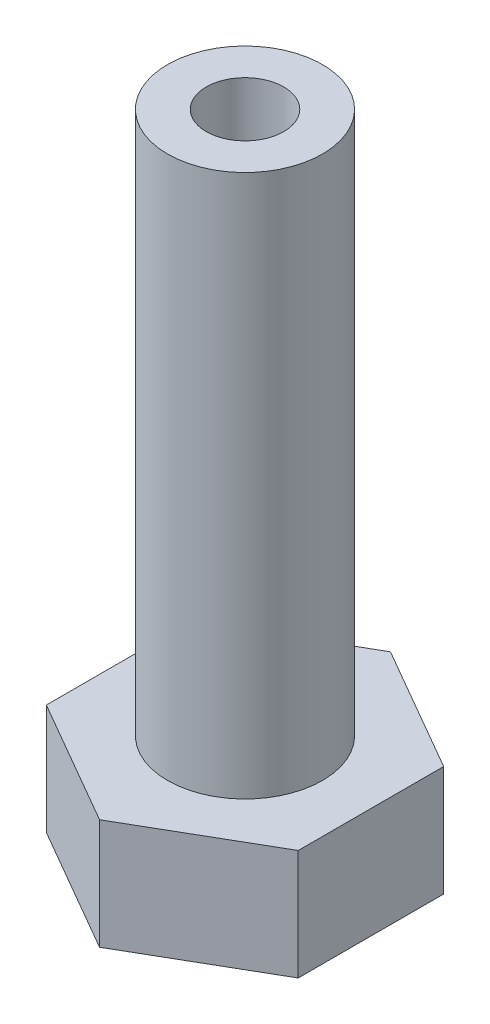
ISO-10303-21;
HEADER;
FILE_DESCRIPTION(('STEP AP214'),'2;1');
FILE_NAME('part.step','',(''),(''),'','','');
FILE_SCHEMA(('AUTOMOTIVE_DESIGN { 1 0 10303 214 1 1 1 1 }'));
ENDSEC;
DATA;
#1=APPLICATION_CONTEXT('core data for automotive mechanical design processes');
#2=APPLICATION_PROTOCOL_DEFINITION('international standard','automotive_design',2000,#1);
#3=PRODUCT_CONTEXT('',#1,'mechanical');
#4=PRODUCT('Part','Part','',(#3));
#5=PRODUCT_RELATED_PRODUCT_CATEGORY('part','',(#4));
#6=PRODUCT_DEFINITION_FORMATION('','',#4);
#7=PRODUCT_DEFINITION_CONTEXT('part definition',#1,'design');
#8=PRODUCT_DEFINITION('design','',#6,#7);
#9=PRODUCT_DEFINITION_SHAPE('','',#8);
#10=(LENGTH_UNIT() NAMED_UNIT(*) SI_UNIT(.MILLI.,.METRE.));
#11=(NAMED_UNIT(*) PLANE_ANGLE_UNIT() SI_UNIT($,.RADIAN.));
#12=(NAMED_UNIT(*) SI_UNIT($,.STERADIAN.) SOLID_ANGLE_UNIT());
#13=UNCERTAINTY_MEASURE_WITH_UNIT(LENGTH_MEASURE(1.E-05),#10,'distance_accuracy_value','');
#14=(GEOMETRIC_REPRESENTATION_CONTEXT(3) GLOBAL_UNCERTAINTY_ASSIGNED_CONTEXT((#13)) GLOBAL_UNIT_ASSIGNED_CONTEXT((#10,
#11,#12)) REPRESENTATION_CONTEXT('',''));
#15=CARTESIAN_POINT('',(0.,0.,0.));
#16=DIRECTION('',(0.,0.,1.));
#17=DIRECTION('',(1.,0.,0.));
#18=AXIS2_PLACEMENT_3D('',#15,#16,#17);
#19=CARTESIAN_POINT('',(-6.5,5.7,3.75277674973257));
#20=DIRECTION('',(0.5,0.,-0.866025403784439));
#21=DIRECTION('',(-0.866025403784439,0.,-0.5));
#22=AXIS2_PLACEMENT_3D('',#19,#20,#21);
#23=PLANE('',#22);
#24=DIRECTION('',(0.866025403784439,0.,0.5));
#25=VECTOR('',#24,1.);
#26=CARTESIAN_POINT('',(-6.5,0.,3.75277674973257));
#27=LINE('',#26,#25);
#28=CARTESIAN_POINT('',(-6.5,0.,3.75277674973257));
#29=VERTEX_POINT('',#28);
#30=CARTESIAN_POINT('',(0.,0.,7.50555349946513));
#31=VERTEX_POINT('',#30);
#32=EDGE_CURVE('E119',#29,#31,#27,.T.);
#33=ORIENTED_EDGE('',*,*,#32,.T.);
#34=DIRECTION('',(0.,-1.,0.));
#35=VECTOR('',#34,1.);
#36=CARTESIAN_POINT('',(0.,5.7,7.50555349946513));
#37=LINE('',#36,#35);
#38=CARTESIAN_POINT('',(0.,5.7,7.50555349946513));
#39=VERTEX_POINT('',#38);
#40=EDGE_CURVE('E36',#39,#31,#37,.T.);
#41=ORIENTED_EDGE('',*,*,#40,.F.);
#42=DIRECTION('',(0.866025403784439,0.,0.5));
#43=VECTOR('',#42,1.);
#44=CARTESIAN_POINT('',(-6.5,5.7,3.75277674973257));
#45=LINE('',#44,#43);
#46=CARTESIAN_POINT('',(-6.5,5.7,3.75277674973257));
#47=VERTEX_POINT('',#46);
#48=EDGE_CURVE('E130',#47,#39,#45,.T.);
#49=ORIENTED_EDGE('',*,*,#48,.F.);
#50=DIRECTION('',(0.,-1.,0.));
#51=VECTOR('',#50,1.);
#52=CARTESIAN_POINT('',(-6.5,5.7,3.75277674973257));
#53=LINE('',#52,#51);
#54=EDGE_CURVE('E115',#47,#29,#53,.T.);
#55=ORIENTED_EDGE('',*,*,#54,.T.);
#56=EDGE_LOOP('',(#33,#41,#49,#55));
#57=FACE_BOUND('',#56,.T.);
#58=ADVANCED_FACE('F33',(#57),#23,.F.);
#59=CARTESIAN_POINT('',(0.,5.7,7.50555349946513));
#60=DIRECTION('',(-0.5,0.,-0.866025403784439));
#61=DIRECTION('',(-0.866025403784439,0.,0.5));
#62=AXIS2_PLACEMENT_3D('',#59,#60,#61);
#63=PLANE('',#62);
#64=DIRECTION('',(0.866025403784439,0.,-0.5));
#65=VECTOR('',#64,1.);
#66=CARTESIAN_POINT('',(0.,0.,7.50555349946513));
#67=LINE('',#66,#65);
#68=CARTESIAN_POINT('',(6.5,0.,3.75277674973257));
#69=VERTEX_POINT('',#68);
#70=EDGE_CURVE('E122',#31,#69,#67,.T.);
#71=ORIENTED_EDGE('',*,*,#70,.T.);
#72=DIRECTION('',(0.,-1.,0.));
#73=VECTOR('',#72,1.);
#74=CARTESIAN_POINT('',(6.5,5.7,3.75277674973257));
#75=LINE('',#74,#73);
#76=CARTESIAN_POINT('',(6.5,5.7,3.75277674973257));
#77=VERTEX_POINT('',#76);
#78=EDGE_CURVE('E133',#77,#69,#75,.T.);
#79=ORIENTED_EDGE('',*,*,#78,.F.);
#80=DIRECTION('',(0.866025403784439,0.,-0.5));
#81=VECTOR('',#80,1.);
#82=CARTESIAN_POINT('',(0.,5.7,7.50555349946513));
#83=LINE('',#82,#81);
#84=EDGE_CURVE('E88',#39,#77,#83,.T.);
#85=ORIENTED_EDGE('',*,*,#84,.F.);
#86=ORIENTED_EDGE('',*,*,#40,.T.);
#87=EDGE_LOOP('',(#71,#79,#85,#86));
#88=FACE_BOUND('',#87,.T.);
#89=ADVANCED_FACE('F138',(#88),#63,.F.);
#90=CARTESIAN_POINT('',(6.5,5.7,3.75277674973257));
#91=DIRECTION('',(-1.,0.,0.));
#92=DIRECTION('',(0.,0.,1.));
#93=AXIS2_PLACEMENT_3D('',#90,#91,#92);
#94=PLANE('',#93);
#95=DIRECTION('',(0.,0.,-1.));
#96=VECTOR('',#95,1.);
#97=CARTESIAN_POINT('',(6.5,0.,3.75277674973257));
#98=LINE('',#97,#96);
#99=CARTESIAN_POINT('',(6.5,0.,-3.75277674973257));
#100=VERTEX_POINT('',#99);
#101=EDGE_CURVE('E125',#69,#100,#98,.T.);
#102=ORIENTED_EDGE('',*,*,#101,.T.);
#103=DIRECTION('',(0.,-1.,0.));
#104=VECTOR('',#103,1.);
#105=CARTESIAN_POINT('',(6.5,5.7,-3.75277674973257));
#106=LINE('',#105,#104);
#107=CARTESIAN_POINT('',(6.5,5.7,-3.75277674973257));
#108=VERTEX_POINT('',#107);
#109=EDGE_CURVE('E110',#108,#100,#106,.T.);
#110=ORIENTED_EDGE('',*,*,#109,.F.);
#111=DIRECTION('',(0.,0.,-1.));
#112=VECTOR('',#111,1.);
#113=CARTESIAN_POINT('',(6.5,5.7,3.75277674973257));
#114=LINE('',#113,#112);
#115=EDGE_CURVE('E101',#77,#108,#114,.T.);
#116=ORIENTED_EDGE('',*,*,#115,.F.);
#117=ORIENTED_EDGE('',*,*,#78,.T.);
#118=EDGE_LOOP('',(#102,#110,#116,#117));
#119=FACE_BOUND('',#118,.T.);
#120=ADVANCED_FACE('F144',(#119),#94,.F.);
#121=CARTESIAN_POINT('',(6.5,5.7,-3.75277674973257));
#122=DIRECTION('',(-0.5,0.,0.866025403784439));
#123=DIRECTION('',(0.866025403784439,0.,0.5));
#124=AXIS2_PLACEMENT_3D('',#121,#122,#123);
#125=PLANE('',#124);
#126=DIRECTION('',(-0.866025403784439,0.,-0.5));
#127=VECTOR('',#126,1.);
#128=CARTESIAN_POINT('',(6.5,0.,-3.75277674973257));
#129=LINE('',#128,#127);
#130=CARTESIAN_POINT('',(0.,0.,-7.50555349946513));
#131=VERTEX_POINT('',#130);
#132=EDGE_CURVE('E109',#100,#131,#129,.T.);
#133=ORIENTED_EDGE('',*,*,#132,.T.);
#134=DIRECTION('',(0.,-1.,0.));
#135=VECTOR('',#134,1.);
#136=CARTESIAN_POINT('',(0.,5.7,-7.50555349946513));
#137=LINE('',#136,#135);
#138=CARTESIAN_POINT('',(0.,5.7,-7.50555349946513));
#139=VERTEX_POINT('',#138);
#140=EDGE_CURVE('E106',#139,#131,#137,.T.);
#141=ORIENTED_EDGE('',*,*,#140,.F.);
#142=DIRECTION('',(-0.866025403784439,0.,-0.5));
#143=VECTOR('',#142,1.);
#144=CARTESIAN_POINT('',(6.5,5.7,-3.75277674973257));
#145=LINE('',#144,#143);
#146=EDGE_CURVE('E95',#108,#139,#145,.T.);
#147=ORIENTED_EDGE('',*,*,#146,.F.);
#148=ORIENTED_EDGE('',*,*,#109,.T.);
#149=EDGE_LOOP('',(#133,#141,#147,#148));
#150=FACE_BOUND('',#149,.T.);
#151=ADVANCED_FACE('F107',(#150),#125,.F.);
#152=CARTESIAN_POINT('',(0.,5.7,-7.50555349946513));
#153=DIRECTION('',(0.5,0.,0.866025403784439));
#154=DIRECTION('',(0.866025403784439,0.,-0.5));
#155=AXIS2_PLACEMENT_3D('',#152,#153,#154);
#156=PLANE('',#155);
#157=DIRECTION('',(-0.866025403784439,0.,0.5));
#158=VECTOR('',#157,1.);
#159=CARTESIAN_POINT('',(0.,0.,-7.50555349946513));
#160=LINE('',#159,#158);
#161=CARTESIAN_POINT('',(-6.5,0.,-3.75277674973257));
#162=VERTEX_POINT('',#161);
#163=EDGE_CURVE('E73',#131,#162,#160,.T.);
#164=ORIENTED_EDGE('',*,*,#163,.T.);
#165=DIRECTION('',(0.,-1.,0.));
#166=VECTOR('',#165,1.);
#167=CARTESIAN_POINT('',(-6.5,5.7,-3.75277674973257));
#168=LINE('',#167,#166);
#169=CARTESIAN_POINT('',(-6.5,5.7,-3.75277674973257));
#170=VERTEX_POINT('',#169);
#171=EDGE_CURVE('E111',#170,#162,#168,.T.);
#172=ORIENTED_EDGE('',*,*,#171,.F.);
#173=DIRECTION('',(-0.866025403784439,0.,0.5));
#174=VECTOR('',#173,1.);
#175=CARTESIAN_POINT('',(0.,5.7,-7.50555349946513));
#176=LINE('',#175,#174);
#177=EDGE_CURVE('E99',#139,#170,#176,.T.);
#178=ORIENTED_EDGE('',*,*,#177,.F.);
#179=ORIENTED_EDGE('',*,*,#140,.T.);
#180=EDGE_LOOP('',(#164,#172,#178,#179));
#181=FACE_BOUND('',#180,.T.);
#182=ADVANCED_FACE('F113',(#181),#156,.F.);
#183=CARTESIAN_POINT('',(-6.5,5.7,-3.75277674973257));
#184=DIRECTION('',(1.,0.,0.));
#185=DIRECTION('',(0.,0.,-1.));
#186=AXIS2_PLACEMENT_3D('',#183,#184,#185);
#187=PLANE('',#186);
#188=DIRECTION('',(0.,0.,1.));
#189=VECTOR('',#188,1.);
#190=CARTESIAN_POINT('',(-6.5,0.,-3.75277674973257));
#191=LINE('',#190,#189);
#192=EDGE_CURVE('E79',#162,#29,#191,.T.);
#193=ORIENTED_EDGE('',*,*,#192,.T.);
#194=ORIENTED_EDGE('',*,*,#54,.F.);
#195=DIRECTION('',(0.,0.,1.));
#196=VECTOR('',#195,1.);
#197=CARTESIAN_POINT('',(-6.5,5.7,-3.75277674973257));
#198=LINE('',#197,#196);
#199=EDGE_CURVE('E50',#170,#47,#198,.T.);
#200=ORIENTED_EDGE('',*,*,#199,.F.);
#201=ORIENTED_EDGE('',*,*,#171,.T.);
#202=EDGE_LOOP('',(#193,#194,#200,#201));
#203=FACE_BOUND('',#202,.T.);
#204=ADVANCED_FACE('F178',(#203),#187,.F.);
#205=CARTESIAN_POINT('',(0.,5.7,0.));
#206=DIRECTION('',(0.,1.,0.));
#207=DIRECTION('',(0.,0.,1.));
#208=AXIS2_PLACEMENT_3D('',#205,#206,#207);
#209=PLANE('',#208);
#210=CARTESIAN_POINT('',(0.,5.7,0.));
#211=DIRECTION('',(0.,1.,0.));
#212=DIRECTION('',(0.,0.,1.));
#213=AXIS2_PLACEMENT_3D('',#210,#211,#212);
#214=CIRCLE('',#213,4.);
#215=CARTESIAN_POINT('',(0.,5.7,4.));
#216=VERTEX_POINT('',#215);
#217=EDGE_CURVE('E11',#216,#216,#214,.T.);
#218=ORIENTED_EDGE('',*,*,#217,.F.);
#219=EDGE_LOOP('',(#218));
#220=FACE_BOUND('',#219,.T.);
#221=ORIENTED_EDGE('',*,*,#48,.T.);
#222=ORIENTED_EDGE('',*,*,#84,.T.);
#223=ORIENTED_EDGE('',*,*,#115,.T.);
#224=ORIENTED_EDGE('',*,*,#146,.T.);
#225=ORIENTED_EDGE('',*,*,#177,.T.);
#226=ORIENTED_EDGE('',*,*,#199,.T.);
#227=EDGE_LOOP('',(#221,#222,#223,#224,#225,#226));
#228=FACE_BOUND('',#227,.T.);
#229=ADVANCED_FACE('F97',(#220,#228),#209,.T.);
#230=CARTESIAN_POINT('',(0.,0.,0.));
#231=DIRECTION('',(0.,1.,0.));
#232=DIRECTION('',(0.,0.,1.));
#233=AXIS2_PLACEMENT_3D('',#230,#231,#232);
#234=PLANE('',#233);
#235=ORIENTED_EDGE('',*,*,#32,.F.);
#236=ORIENTED_EDGE('',*,*,#192,.F.);
#237=ORIENTED_EDGE('',*,*,#163,.F.);
#238=ORIENTED_EDGE('',*,*,#132,.F.);
#239=ORIENTED_EDGE('',*,*,#101,.F.);
#240=ORIENTED_EDGE('',*,*,#70,.F.);
#241=EDGE_LOOP('',(#235,#236,#237,#238,#239,#240));
#242=FACE_BOUND('',#241,.T.);
#243=ADVANCED_FACE('F143',(#242),#234,.F.);
#244=CARTESIAN_POINT('',(0.,33.7,0.));
#245=DIRECTION('',(0.,-1.,0.));
#246=DIRECTION('',(0.,0.,-1.));
#247=AXIS2_PLACEMENT_3D('',#244,#245,#246);
#248=CYLINDRICAL_SURFACE('',#247,4.);
#249=CARTESIAN_POINT('',(0.,33.7,0.));
#250=DIRECTION('',(0.,1.,0.));
#251=DIRECTION('',(0.,0.,1.));
#252=AXIS2_PLACEMENT_3D('',#249,#250,#251);
#253=CIRCLE('',#252,4.);
#254=CARTESIAN_POINT('',(0.,33.7,4.));
#255=VERTEX_POINT('',#254);
#256=EDGE_CURVE('E123',#255,#255,#253,.T.);
#257=ORIENTED_EDGE('',*,*,#256,.F.);
#258=EDGE_LOOP('',(#257));
#259=FACE_BOUND('',#258,.T.);
#260=ORIENTED_EDGE('',*,*,#217,.T.);
#261=EDGE_LOOP('',(#260));
#262=FACE_BOUND('',#261,.T.);
#263=ADVANCED_FACE('F168',(#259,#262),#248,.T.);
#264=CARTESIAN_POINT('',(0.,33.7,0.));
#265=DIRECTION('',(0.,1.,0.));
#266=DIRECTION('',(0.,0.,1.));
#267=AXIS2_PLACEMENT_3D('',#264,#265,#266);
#268=PLANE('',#267);
#269=CARTESIAN_POINT('',(0.,33.7,0.));
#270=DIRECTION('',(0.,1.,0.));
#271=DIRECTION('',(0.,0.,1.));
#272=AXIS2_PLACEMENT_3D('',#269,#270,#271);
#273=CIRCLE('',#272,2.);
#274=CARTESIAN_POINT('',(0.,33.7,2.));
#275=VERTEX_POINT('',#274);
#276=EDGE_CURVE('E151',#275,#275,#273,.T.);
#277=ORIENTED_EDGE('',*,*,#276,.F.);
#278=EDGE_LOOP('',(#277));
#279=FACE_BOUND('',#278,.T.);
#280=ORIENTED_EDGE('',*,*,#256,.T.);
#281=EDGE_LOOP('',(#280));
#282=FACE_BOUND('',#281,.T.);
#283=ADVANCED_FACE('F162',(#279,#282),#268,.T.);
#284=CARTESIAN_POINT('',(0.,25.7,0.));
#285=DIRECTION('',(0.,1.,0.));
#286=DIRECTION('',(0.,0.,1.));
#287=AXIS2_PLACEMENT_3D('',#284,#285,#286);
#288=CYLINDRICAL_SURFACE('',#287,2.);
#289=CARTESIAN_POINT('',(0.,25.7,0.));
#290=DIRECTION('',(0.,1.,0.));
#291=DIRECTION('',(0.,0.,1.));
#292=AXIS2_PLACEMENT_3D('',#289,#290,#291);
#293=CIRCLE('',#292,2.);
#294=CARTESIAN_POINT('',(0.,25.7,2.));
#295=VERTEX_POINT('',#294);
#296=EDGE_CURVE('E150',#295,#295,#293,.T.);
#297=ORIENTED_EDGE('',*,*,#296,.F.);
#298=EDGE_LOOP('',(#297));
#299=FACE_BOUND('',#298,.T.);
#300=ORIENTED_EDGE('',*,*,#276,.T.);
#301=EDGE_LOOP('',(#300));
#302=FACE_BOUND('',#301,.T.);
#303=ADVANCED_FACE('F159',(#299,#302),#288,.F.);
#304=CARTESIAN_POINT('',(0.,25.7,0.));
#305=DIRECTION('',(0.,1.,0.));
#306=DIRECTION('',(0.,0.,1.));
#307=AXIS2_PLACEMENT_3D('',#304,#305,#306);
#308=PLANE('',#307);
#309=ORIENTED_EDGE('',*,*,#296,.T.);
#310=EDGE_LOOP('',(#309));
#311=FACE_BOUND('',#310,.T.);
#312=ADVANCED_FACE('F157',(#311),#308,.T.);
#313=CLOSED_SHELL('',(#58,#89,#120,#151,#182,#204,#229,#243,#263,#283,#303,#312));
#314=MANIFOLD_SOLID_BREP('B2',#313);
#315=ADVANCED_BREP_SHAPE_REPRESENTATION('',(#18,#314),#14);
#316=SHAPE_DEFINITION_REPRESENTATION(#9,#315);
ENDSEC;
END-ISO-10303-21;
